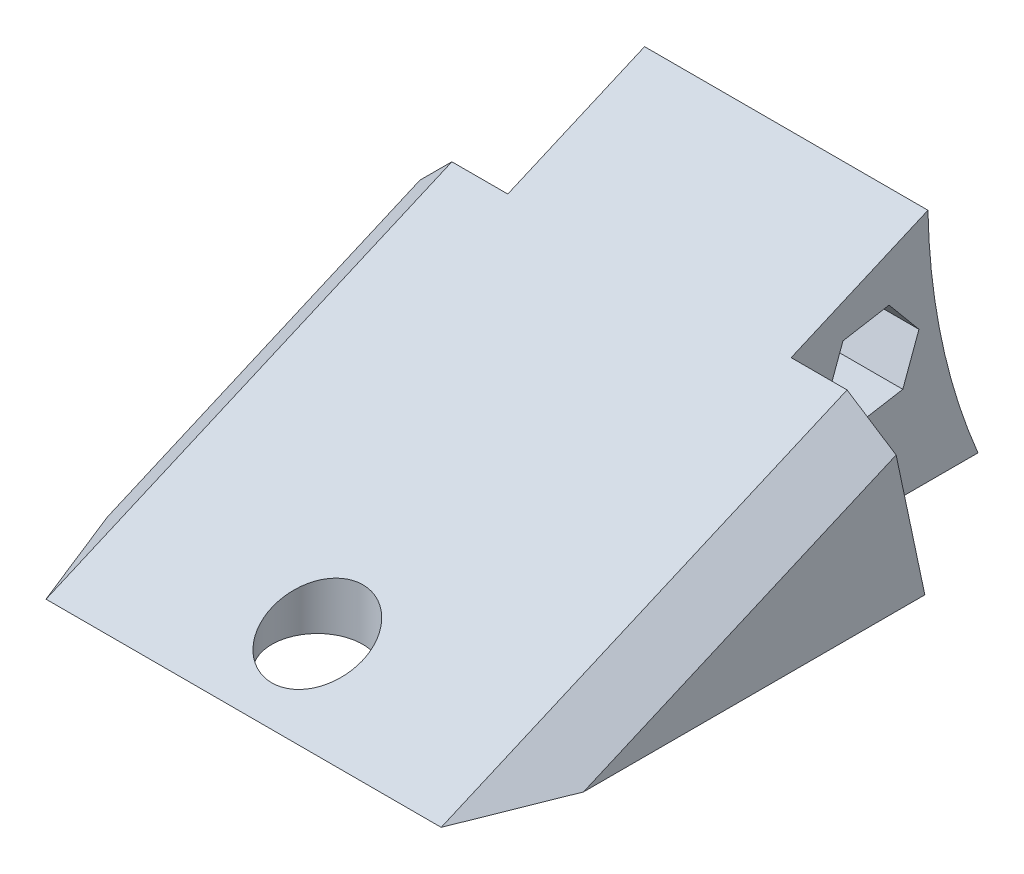
ISO-10303-21;
HEADER;
FILE_DESCRIPTION(('STEP AP214'),'2;1');
FILE_NAME('part.step','',(''),(''),'','','');
FILE_SCHEMA(('AUTOMOTIVE_DESIGN { 1 0 10303 214 1 1 1 1 }'));
ENDSEC;
DATA;
#1=APPLICATION_CONTEXT('core data for automotive mechanical design processes');
#2=APPLICATION_PROTOCOL_DEFINITION('international standard','automotive_design',2000,#1);
#3=PRODUCT_CONTEXT('',#1,'mechanical');
#4=PRODUCT('Part','Part','',(#3));
#5=PRODUCT_RELATED_PRODUCT_CATEGORY('part','',(#4));
#6=PRODUCT_DEFINITION_FORMATION('','',#4);
#7=PRODUCT_DEFINITION_CONTEXT('part definition',#1,'design');
#8=PRODUCT_DEFINITION('design','',#6,#7);
#9=PRODUCT_DEFINITION_SHAPE('','',#8);
#10=(LENGTH_UNIT() NAMED_UNIT(*) SI_UNIT(.MILLI.,.METRE.));
#11=(NAMED_UNIT(*) PLANE_ANGLE_UNIT() SI_UNIT($,.RADIAN.));
#12=(NAMED_UNIT(*) SI_UNIT($,.STERADIAN.) SOLID_ANGLE_UNIT());
#13=UNCERTAINTY_MEASURE_WITH_UNIT(LENGTH_MEASURE(1.E-05),#10,'distance_accuracy_value','');
#14=(GEOMETRIC_REPRESENTATION_CONTEXT(3) GLOBAL_UNCERTAINTY_ASSIGNED_CONTEXT((#13)) GLOBAL_UNIT_ASSIGNED_CONTEXT((#10,
#11,#12)) REPRESENTATION_CONTEXT('',''));
#15=CARTESIAN_POINT('',(0.,0.,0.));
#16=DIRECTION('',(0.,0.,1.));
#17=DIRECTION('',(1.,0.,0.));
#18=AXIS2_PLACEMENT_3D('',#15,#16,#17);
#19=CARTESIAN_POINT('',(43.38895928072,37.5,0.));
#20=DIRECTION('',(0.,1.,0.));
#21=DIRECTION('',(0.,0.,1.));
#22=AXIS2_PLACEMENT_3D('',#19,#20,#21);
#23=PLANE('',#22);
#24=CARTESIAN_POINT('',(0.,37.5,109.321224588876));
#25=DIRECTION('',(0.,1.,0.));
#26=DIRECTION('',(0.,0.,1.));
#27=AXIS2_PLACEMENT_3D('',#24,#25,#26);
#28=CIRCLE('',#27,4.5);
#29=CARTESIAN_POINT('',(0.,37.5,113.821224588876));
#30=VERTEX_POINT('',#29);
#31=EDGE_CURVE('E252',#30,#30,#28,.T.);
#32=ORIENTED_EDGE('',*,*,#31,.T.);
#33=EDGE_LOOP('',(#32));
#34=FACE_BOUND('',#33,.T.);
#35=DIRECTION('',(-1.,0.,0.));
#36=VECTOR('',#35,1.);
#37=CARTESIAN_POINT('',(71.1880662084405,37.5,116.608854977767));
#38=LINE('',#37,#36);
#39=CARTESIAN_POINT('',(19.525,37.5,116.608854977767));
#40=VERTEX_POINT('',#39);
#41=CARTESIAN_POINT('',(-19.525,37.5,116.608854977767));
#42=VERTEX_POINT('',#41);
#43=EDGE_CURVE('E264',#40,#42,#38,.T.);
#44=ORIENTED_EDGE('',*,*,#43,.T.);
#45=DIRECTION('',(-0.369479629785518,0.,-0.929238829996657));
#46=VECTOR('',#45,1.);
#47=CARTESIAN_POINT('',(-48.534045440784,37.5,43.6512971812466));
#48=LINE('',#47,#46);
#49=CARTESIAN_POINT('',(-23.525,37.5,106.548881381539));
#50=VERTEX_POINT('',#49);
#51=EDGE_CURVE('E241',#42,#50,#48,.T.);
#52=ORIENTED_EDGE('',*,*,#51,.T.);
#53=DIRECTION('',(0.,0.,-1.));
#54=VECTOR('',#53,1.);
#55=CARTESIAN_POINT('',(-23.525,37.5,0.));
#56=LINE('',#55,#54);
#57=CARTESIAN_POINT('',(-23.525,37.5,72.8184863524507));
#58=VERTEX_POINT('',#57);
#59=EDGE_CURVE('E254',#50,#58,#56,.T.);
#60=ORIENTED_EDGE('',*,*,#59,.T.);
#61=DIRECTION('',(-1.,0.,0.));
#62=VECTOR('',#61,1.);
#63=CARTESIAN_POINT('',(43.38895928072,37.5,72.8184863524507));
#64=LINE('',#63,#62);
#65=CARTESIAN_POINT('',(-14.,37.5,72.8184863524507));
#66=VERTEX_POINT('',#65);
#67=EDGE_CURVE('E171',#66,#58,#64,.T.);
#68=ORIENTED_EDGE('',*,*,#67,.F.);
#69=DIRECTION('',(0.,0.,-1.));
#70=VECTOR('',#69,1.);
#71=CARTESIAN_POINT('',(-14.,37.5,0.));
#72=LINE('',#71,#70);
#73=CARTESIAN_POINT('',(-14.,37.5,58.0409338312195));
#74=VERTEX_POINT('',#73);
#75=EDGE_CURVE('E161',#66,#74,#72,.T.);
#76=ORIENTED_EDGE('',*,*,#75,.T.);
#77=DIRECTION('',(-1.,0.,0.));
#78=VECTOR('',#77,1.);
#79=CARTESIAN_POINT('',(43.38895928072,37.5,58.0409338312195));
#80=LINE('',#79,#78);
#81=CARTESIAN_POINT('',(14.,37.5,58.0409338312195));
#82=VERTEX_POINT('',#81);
#83=EDGE_CURVE('E145',#82,#74,#80,.T.);
#84=ORIENTED_EDGE('',*,*,#83,.F.);
#85=DIRECTION('',(0.,0.,-1.));
#86=VECTOR('',#85,1.);
#87=CARTESIAN_POINT('',(14.,37.5,0.));
#88=LINE('',#87,#86);
#89=CARTESIAN_POINT('',(14.,37.5,72.8184863524507));
#90=VERTEX_POINT('',#89);
#91=EDGE_CURVE('E205',#90,#82,#88,.T.);
#92=ORIENTED_EDGE('',*,*,#91,.F.);
#93=DIRECTION('',(-1.,0.,0.));
#94=VECTOR('',#93,1.);
#95=CARTESIAN_POINT('',(43.38895928072,37.5,72.8184863524507));
#96=LINE('',#95,#94);
#97=CARTESIAN_POINT('',(23.525,37.5,72.8184863524507));
#98=VERTEX_POINT('',#97);
#99=EDGE_CURVE('E255',#98,#90,#96,.T.);
#100=ORIENTED_EDGE('',*,*,#99,.F.);
#101=DIRECTION('',(0.,0.,-1.));
#102=VECTOR('',#101,1.);
#103=CARTESIAN_POINT('',(23.525,37.5,0.));
#104=LINE('',#103,#102);
#105=CARTESIAN_POINT('',(23.525,37.5,106.548881381539));
#106=VERTEX_POINT('',#105);
#107=EDGE_CURVE('E273',#106,#98,#104,.T.);
#108=ORIENTED_EDGE('',*,*,#107,.F.);
#109=DIRECTION('',(-0.369479629785519,0.,0.929238829996657));
#110=VECTOR('',#109,1.);
#111=CARTESIAN_POINT('',(57.3922757474116,37.5,21.3729064327504));
#112=LINE('',#111,#110);
#113=EDGE_CURVE('E239',#106,#40,#112,.T.);
#114=ORIENTED_EDGE('',*,*,#113,.T.);
#115=EDGE_LOOP('',(#44,#52,#60,#68,#76,#84,#92,#100,#108,#114));
#116=FACE_BOUND('',#115,.T.);
#117=ADVANCED_FACE('F44',(#34,#116),#23,.F.);
#118=CARTESIAN_POINT('',(43.38895928072,62.,0.));
#119=DIRECTION('',(-1.,0.,0.));
#120=DIRECTION('',(0.,0.,1.));
#121=AXIS2_PLACEMENT_3D('',#118,#119,#120);
#122=CYLINDRICAL_SURFACE('',#121,63.);
#123=CARTESIAN_POINT('',(14.,62.,0.));
#124=DIRECTION('',(1.,0.,0.));
#125=DIRECTION('',(0.,0.,-1.));
#126=AXIS2_PLACEMENT_3D('',#123,#124,#125);
#127=CIRCLE('',#126,63.);
#128=CARTESIAN_POINT('',(14.,60.7365441284118,62.9873295136454));
#129=VERTEX_POINT('',#128);
#130=EDGE_CURVE('E151',#82,#129,#127,.F.);
#131=ORIENTED_EDGE('',*,*,#130,.F.);
#132=ORIENTED_EDGE('',*,*,#83,.T.);
#133=CARTESIAN_POINT('',(-14.,62.,0.));
#134=DIRECTION('',(-1.,0.,0.));
#135=DIRECTION('',(0.,0.,1.));
#136=AXIS2_PLACEMENT_3D('',#133,#134,#135);
#137=CIRCLE('',#136,63.);
#138=CARTESIAN_POINT('',(-14.,60.7365441284118,62.9873295136454));
#139=VERTEX_POINT('',#138);
#140=EDGE_CURVE('E149',#74,#139,#137,.T.);
#141=ORIENTED_EDGE('',*,*,#140,.T.);
#142=DIRECTION('',(-1.,0.,0.));
#143=VECTOR('',#142,1.);
#144=CARTESIAN_POINT('',(43.38895928072,60.7365441284118,62.9873295136454));
#145=LINE('',#144,#143);
#146=EDGE_CURVE('E155',#129,#139,#145,.T.);
#147=ORIENTED_EDGE('',*,*,#146,.F.);
#148=EDGE_LOOP('',(#131,#132,#141,#147));
#149=FACE_BOUND('',#148,.T.);
#150=ADVANCED_FACE('F147',(#149),#122,.F.);
#151=CARTESIAN_POINT('',(43.38895928072,74.1140661666152,32.1168552015343));
#152=DIRECTION('',(0.,-0.917552193237277,-0.397615357708254));
#153=DIRECTION('',(0.,0.397615357708254,-0.917552193237277));
#154=AXIS2_PLACEMENT_3D('',#151,#152,#153);
#155=PLANE('',#154);
#156=CARTESIAN_POINT('',(0.,40.6580478857568,109.321224588876));
#157=DIRECTION('',(0.,-0.917552193237277,-0.397615357708254));
#158=DIRECTION('',(0.,-0.397615357708254,0.917552193237277));
#159=AXIS2_PLACEMENT_3D('',#156,#157,#158);
#160=ELLIPSE('',#159,4.90435316177846,4.5);
#161=CARTESIAN_POINT('',(0.,38.7080017490087,113.821224588876));
#162=VERTEX_POINT('',#161);
#163=EDGE_CURVE('E248',#162,#162,#160,.F.);
#164=ORIENTED_EDGE('',*,*,#163,.F.);
#165=EDGE_LOOP('',(#164));
#166=FACE_BOUND('',#165,.T.);
#167=DIRECTION('',(-1.,0.,0.));
#168=VECTOR('',#167,1.);
#169=CARTESIAN_POINT('',(71.1880662084405,54.8797179048589,76.5027625638284));
#170=LINE('',#169,#168);
#171=CARTESIAN_POINT('',(-14.,54.879717904859,76.5027625638284));
#172=VERTEX_POINT('',#171);
#173=CARTESIAN_POINT('',(-19.525,54.879717904859,76.5027625638285));
#174=VERTEX_POINT('',#173);
#175=EDGE_CURVE('E258',#172,#174,#170,.T.);
#176=ORIENTED_EDGE('',*,*,#175,.T.);
#177=DIRECTION('',(0.,-0.397615357708254,0.917552193237277));
#178=VECTOR('',#177,1.);
#179=CARTESIAN_POINT('',(-19.525,37.5,116.608854977767));
#180=LINE('',#179,#178);
#181=EDGE_CURVE('E236',#174,#42,#180,.T.);
#182=ORIENTED_EDGE('',*,*,#181,.T.);
#183=ORIENTED_EDGE('',*,*,#43,.F.);
#184=DIRECTION('',(0.,0.397615357708254,-0.917552193237277));
#185=VECTOR('',#184,1.);
#186=CARTESIAN_POINT('',(19.525,55.0825700006713,76.034653418125));
#187=LINE('',#186,#185);
#188=CARTESIAN_POINT('',(19.525,54.879717904859,76.5027625638285));
#189=VERTEX_POINT('',#188);
#190=EDGE_CURVE('E203',#40,#189,#187,.T.);
#191=ORIENTED_EDGE('',*,*,#190,.T.);
#192=DIRECTION('',(-1.,0.,0.));
#193=VECTOR('',#192,1.);
#194=CARTESIAN_POINT('',(71.1880662084405,54.8797179048589,76.5027625638284));
#195=LINE('',#194,#193);
#196=CARTESIAN_POINT('',(14.,54.879717904859,76.5027625638284));
#197=VERTEX_POINT('',#196);
#198=EDGE_CURVE('E261',#189,#197,#195,.T.);
#199=ORIENTED_EDGE('',*,*,#198,.T.);
#200=DIRECTION('',(0.,-0.397615357708254,0.917552193237277));
#201=VECTOR('',#200,1.);
#202=CARTESIAN_POINT('',(14.,74.1140661666152,32.1168552015343));
#203=LINE('',#202,#201);
#204=EDGE_CURVE('E200',#129,#197,#203,.T.);
#205=ORIENTED_EDGE('',*,*,#204,.F.);
#206=ORIENTED_EDGE('',*,*,#146,.T.);
#207=DIRECTION('',(0.,-0.397615357708254,0.917552193237277));
#208=VECTOR('',#207,1.);
#209=CARTESIAN_POINT('',(-14.,74.1140661666152,32.1168552015343));
#210=LINE('',#209,#208);
#211=EDGE_CURVE('E164',#139,#172,#210,.T.);
#212=ORIENTED_EDGE('',*,*,#211,.T.);
#213=EDGE_LOOP('',(#176,#182,#183,#191,#199,#205,#206,#212));
#214=FACE_BOUND('',#213,.T.);
#215=ADVANCED_FACE('F278',(#166,#214),#155,.F.);
#216=CARTESIAN_POINT('',(43.38895928072,64.1529755927277,11.0578583407304));
#217=DIRECTION('',(0.,-0.985467829579259,-0.169862170197913));
#218=DIRECTION('',(0.,0.169862170197913,-0.985467829579259));
#219=AXIS2_PLACEMENT_3D('',#216,#217,#218);
#220=PLANE('',#219);
#221=DIRECTION('',(-1.,0.,0.));
#222=VECTOR('',#221,1.);
#223=CARTESIAN_POINT('',(43.38895928072,54.5396347679766,66.8303596960064));
#224=LINE('',#223,#222);
#225=CARTESIAN_POINT('',(14.,54.5396347679766,66.8303596960064));
#226=VERTEX_POINT('',#225);
#227=CARTESIAN_POINT('',(-14.,54.5396347679766,66.8303596960064));
#228=VERTEX_POINT('',#227);
#229=EDGE_CURVE('E215',#226,#228,#224,.T.);
#230=ORIENTED_EDGE('',*,*,#229,.F.);
#231=DIRECTION('',(0.,-0.169862170197913,0.985467829579259));
#232=VECTOR('',#231,1.);
#233=CARTESIAN_POINT('',(14.,64.1529755927277,11.0578583407304));
#234=LINE('',#233,#232);
#235=CARTESIAN_POINT('',(14.,53.7550750104654,71.3820406294888));
#236=VERTEX_POINT('',#235);
#237=EDGE_CURVE('E208',#226,#236,#234,.T.);
#238=ORIENTED_EDGE('',*,*,#237,.T.);
#239=DIRECTION('',(-1.,0.,0.));
#240=VECTOR('',#239,1.);
#241=CARTESIAN_POINT('',(43.38895928072,53.7550750104654,71.3820406294888));
#242=LINE('',#241,#240);
#243=CARTESIAN_POINT('',(-14.,53.7550750104654,71.3820406294888));
#244=VERTEX_POINT('',#243);
#245=EDGE_CURVE('E211',#236,#244,#242,.T.);
#246=ORIENTED_EDGE('',*,*,#245,.T.);
#247=DIRECTION('',(0.,-0.169862170197913,0.985467829579259));
#248=VECTOR('',#247,1.);
#249=CARTESIAN_POINT('',(-14.,64.1529755927277,11.0578583407304));
#250=LINE('',#249,#248);
#251=EDGE_CURVE('E165',#228,#244,#250,.T.);
#252=ORIENTED_EDGE('',*,*,#251,.F.);
#253=EDGE_LOOP('',(#230,#238,#246,#252));
#254=FACE_BOUND('',#253,.T.);
#255=ADVANCED_FACE('F341',(#254),#220,.T.);
#256=CARTESIAN_POINT('',(43.38895928072,-10.533770106256,12.6520886210708));
#257=DIRECTION('',(0.,-0.639838869322976,0.768509089928997));
#258=DIRECTION('',(0.,-0.768509089928997,-0.639838869322976));
#259=AXIS2_PLACEMENT_3D('',#256,#257,#258);
#260=PLANE('',#259);
#261=DIRECTION('',(-1.,0.,0.));
#262=VECTOR('',#261,1.);
#263=CARTESIAN_POINT('',(43.38895928072,50.9900433284151,63.8750705484735));
#264=LINE('',#263,#262);
#265=CARTESIAN_POINT('',(14.,50.9900433284151,63.8750705484735));
#266=VERTEX_POINT('',#265);
#267=CARTESIAN_POINT('',(-14.,50.9900433284151,63.8750705484735));
#268=VERTEX_POINT('',#267);
#269=EDGE_CURVE('E219',#266,#268,#264,.T.);
#270=ORIENTED_EDGE('',*,*,#269,.F.);
#271=DIRECTION('',(0.,0.768509089928997,0.639838869322976));
#272=VECTOR('',#271,1.);
#273=CARTESIAN_POINT('',(14.,-10.533770106256,12.6520886210708));
#274=LINE('',#273,#272);
#275=EDGE_CURVE('E212',#266,#226,#274,.T.);
#276=ORIENTED_EDGE('',*,*,#275,.T.);
#277=ORIENTED_EDGE('',*,*,#229,.T.);
#278=DIRECTION('',(0.,0.768509089928997,0.639838869322976));
#279=VECTOR('',#278,1.);
#280=CARTESIAN_POINT('',(-14.,-10.533770106256,12.6520886210708));
#281=LINE('',#280,#279);
#282=EDGE_CURVE('E172',#268,#228,#281,.T.);
#283=ORIENTED_EDGE('',*,*,#282,.F.);
#284=EDGE_LOOP('',(#270,#276,#277,#283));
#285=FACE_BOUND('',#284,.T.);
#286=ADVANCED_FACE('F345',(#285),#260,.T.);
#287=CARTESIAN_POINT('',(43.38895928072,26.807730824468,72.7821075417009));
#288=DIRECTION('',(0.,0.345628960256283,0.938371260126908));
#289=DIRECTION('',(0.,-0.938371260126908,0.345628960256283));
#290=AXIS2_PLACEMENT_3D('',#287,#288,#289);
#291=PLANE('',#290);
#292=DIRECTION('',(-1.,0.,0.));
#293=VECTOR('',#292,1.);
#294=CARTESIAN_POINT('',(43.38895928072,46.6558921313425,65.4714623344231));
#295=LINE('',#294,#293);
#296=CARTESIAN_POINT('',(14.,46.6558921313425,65.4714623344231));
#297=VERTEX_POINT('',#296);
#298=CARTESIAN_POINT('',(-14.,46.6558921313425,65.4714623344231));
#299=VERTEX_POINT('',#298);
#300=EDGE_CURVE('E223',#297,#299,#295,.T.);
#301=ORIENTED_EDGE('',*,*,#300,.F.);
#302=DIRECTION('',(0.,0.938371260126908,-0.345628960256283));
#303=VECTOR('',#302,1.);
#304=CARTESIAN_POINT('',(14.,26.807730824468,72.7821075417009));
#305=LINE('',#304,#303);
#306=EDGE_CURVE('E216',#297,#266,#305,.T.);
#307=ORIENTED_EDGE('',*,*,#306,.T.);
#308=ORIENTED_EDGE('',*,*,#269,.T.);
#309=DIRECTION('',(0.,0.938371260126908,-0.345628960256283));
#310=VECTOR('',#309,1.);
#311=CARTESIAN_POINT('',(-14.,26.807730824468,72.7821075417009));
#312=LINE('',#311,#310);
#313=EDGE_CURVE('E176',#299,#268,#312,.T.);
#314=ORIENTED_EDGE('',*,*,#313,.F.);
#315=EDGE_LOOP('',(#301,#307,#308,#314));
#316=FACE_BOUND('',#315,.T.);
#317=ADVANCED_FACE('F351',(#316),#291,.T.);
#318=CARTESIAN_POINT('',(43.38895928072,56.2692329560937,9.69896097914706));
#319=DIRECTION('',(0.,0.985467829579259,0.169862170197913));
#320=DIRECTION('',(0.,-0.169862170197913,0.985467829579259));
#321=AXIS2_PLACEMENT_3D('',#318,#319,#320);
#322=PLANE('',#321);
#323=DIRECTION('',(-1.,0.,0.));
#324=VECTOR('',#323,1.);
#325=CARTESIAN_POINT('',(43.38895928072,45.8713323738313,70.0231432679055));
#326=LINE('',#325,#324);
#327=CARTESIAN_POINT('',(14.,45.8713323738313,70.0231432679055));
#328=VERTEX_POINT('',#327);
#329=CARTESIAN_POINT('',(-14.,45.8713323738313,70.0231432679055));
#330=VERTEX_POINT('',#329);
#331=EDGE_CURVE('E199',#328,#330,#326,.T.);
#332=ORIENTED_EDGE('',*,*,#331,.F.);
#333=DIRECTION('',(0.,0.169862170197913,-0.985467829579259));
#334=VECTOR('',#333,1.);
#335=CARTESIAN_POINT('',(14.,56.2692329560937,9.69896097914706));
#336=LINE('',#335,#334);
#337=EDGE_CURVE('E220',#328,#297,#336,.T.);
#338=ORIENTED_EDGE('',*,*,#337,.T.);
#339=ORIENTED_EDGE('',*,*,#300,.T.);
#340=DIRECTION('',(0.,0.169862170197913,-0.985467829579259));
#341=VECTOR('',#340,1.);
#342=CARTESIAN_POINT('',(-14.,56.2692329560937,9.69896097914706));
#343=LINE('',#342,#341);
#344=EDGE_CURVE('E184',#330,#299,#343,.T.);
#345=ORIENTED_EDGE('',*,*,#344,.F.);
#346=EDGE_LOOP('',(#332,#338,#339,#345));
#347=FACE_BOUND('',#346,.T.);
#348=ADVANCED_FACE('F355',(#347),#322,.T.);
#349=CARTESIAN_POINT('',(43.38895928072,-15.6524810608398,18.8001613405028));
#350=DIRECTION('',(0.,0.639838869322976,-0.768509089928997));
#351=DIRECTION('',(0.,0.768509089928997,0.639838869322976));
#352=AXIS2_PLACEMENT_3D('',#349,#350,#351);
#353=PLANE('',#352);
#354=DIRECTION('',(-1.,0.,0.));
#355=VECTOR('',#354,1.);
#356=CARTESIAN_POINT('',(43.38895928072,49.4209238133928,72.9784324154383));
#357=LINE('',#356,#355);
#358=CARTESIAN_POINT('',(14.,49.4209238133928,72.9784324154383));
#359=VERTEX_POINT('',#358);
#360=CARTESIAN_POINT('',(-14.,49.4209238133928,72.9784324154383));
#361=VERTEX_POINT('',#360);
#362=EDGE_CURVE('E198',#359,#361,#357,.T.);
#363=ORIENTED_EDGE('',*,*,#362,.F.);
#364=DIRECTION('',(0.,-0.768509089928997,-0.639838869322976));
#365=VECTOR('',#364,1.);
#366=CARTESIAN_POINT('',(14.,-15.6524810608398,18.8001613405028));
#367=LINE('',#366,#365);
#368=EDGE_CURVE('E224',#359,#328,#367,.T.);
#369=ORIENTED_EDGE('',*,*,#368,.T.);
#370=ORIENTED_EDGE('',*,*,#331,.T.);
#371=DIRECTION('',(0.,-0.768509089928997,-0.639838869322976));
#372=VECTOR('',#371,1.);
#373=CARTESIAN_POINT('',(-14.,-15.6524810608398,18.8001613405028));
#374=LINE('',#373,#372);
#375=EDGE_CURVE('E187',#361,#330,#374,.T.);
#376=ORIENTED_EDGE('',*,*,#375,.F.);
#377=EDGE_LOOP('',(#363,#369,#370,#376));
#378=FACE_BOUND('',#377,.T.);
#379=ADVANCED_FACE('F359',(#378),#353,.T.);
#380=CARTESIAN_POINT('',(43.38895928072,29.5727625065183,80.2890776227161));
#381=DIRECTION('',(0.,-0.345628960256283,-0.938371260126908));
#382=DIRECTION('',(0.,0.938371260126908,-0.345628960256283));
#383=AXIS2_PLACEMENT_3D('',#380,#381,#382);
#384=PLANE('',#383);
#385=ORIENTED_EDGE('',*,*,#245,.F.);
#386=DIRECTION('',(0.,-0.938371260126908,0.345628960256283));
#387=VECTOR('',#386,1.);
#388=CARTESIAN_POINT('',(14.,29.5727625065183,80.2890776227161));
#389=LINE('',#388,#387);
#390=EDGE_CURVE('E195',#236,#359,#389,.T.);
#391=ORIENTED_EDGE('',*,*,#390,.T.);
#392=ORIENTED_EDGE('',*,*,#362,.T.);
#393=DIRECTION('',(0.,-0.938371260126908,0.345628960256283));
#394=VECTOR('',#393,1.);
#395=CARTESIAN_POINT('',(-14.,29.5727625065183,80.2890776227161));
#396=LINE('',#395,#394);
#397=EDGE_CURVE('E190',#244,#361,#396,.T.);
#398=ORIENTED_EDGE('',*,*,#397,.F.);
#399=EDGE_LOOP('',(#385,#391,#392,#398));
#400=FACE_BOUND('',#399,.T.);
#401=ADVANCED_FACE('F321',(#400),#384,.T.);
#402=CARTESIAN_POINT('',(14.,62.,0.));
#403=DIRECTION('',(1.,0.,0.));
#404=DIRECTION('',(0.,0.,-1.));
#405=AXIS2_PLACEMENT_3D('',#402,#403,#404);
#406=PLANE('',#405);
#407=ORIENTED_EDGE('',*,*,#237,.F.);
#408=ORIENTED_EDGE('',*,*,#275,.F.);
#409=ORIENTED_EDGE('',*,*,#306,.F.);
#410=ORIENTED_EDGE('',*,*,#337,.F.);
#411=ORIENTED_EDGE('',*,*,#368,.F.);
#412=ORIENTED_EDGE('',*,*,#390,.F.);
#413=EDGE_LOOP('',(#407,#408,#409,#410,#411,#412));
#414=FACE_BOUND('',#413,.T.);
#415=DIRECTION('',(0.,-0.978260745904019,-0.20737867060841));
#416=VECTOR('',#415,1.);
#417=CARTESIAN_POINT('',(14.,-13.1599946615431,62.0792203746142));
#418=LINE('',#417,#416);
#419=EDGE_CURVE('E207',#197,#90,#418,.T.);
#420=ORIENTED_EDGE('',*,*,#419,.T.);
#421=ORIENTED_EDGE('',*,*,#91,.T.);
#422=ORIENTED_EDGE('',*,*,#130,.T.);
#423=ORIENTED_EDGE('',*,*,#204,.T.);
#424=EDGE_LOOP('',(#420,#421,#422,#423));
#425=FACE_BOUND('',#424,.T.);
#426=ADVANCED_FACE('F289',(#414,#425),#406,.T.);
#427=CARTESIAN_POINT('',(-14.,62.,0.));
#428=DIRECTION('',(-1.,0.,0.));
#429=DIRECTION('',(0.,0.,-1.));
#430=AXIS2_PLACEMENT_3D('',#427,#428,#429);
#431=PLANE('',#430);
#432=ORIENTED_EDGE('',*,*,#75,.F.);
#433=DIRECTION('',(0.,-0.978260745904019,-0.20737867060841));
#434=VECTOR('',#433,1.);
#435=CARTESIAN_POINT('',(-14.,46.1736387310116,74.6571859802402));
#436=LINE('',#435,#434);
#437=EDGE_CURVE('E173',#172,#66,#436,.T.);
#438=ORIENTED_EDGE('',*,*,#437,.F.);
#439=ORIENTED_EDGE('',*,*,#211,.F.);
#440=ORIENTED_EDGE('',*,*,#140,.F.);
#441=EDGE_LOOP('',(#432,#438,#439,#440));
#442=FACE_BOUND('',#441,.T.);
#443=ORIENTED_EDGE('',*,*,#282,.T.);
#444=ORIENTED_EDGE('',*,*,#251,.T.);
#445=ORIENTED_EDGE('',*,*,#397,.T.);
#446=ORIENTED_EDGE('',*,*,#375,.T.);
#447=ORIENTED_EDGE('',*,*,#344,.T.);
#448=ORIENTED_EDGE('',*,*,#313,.T.);
#449=EDGE_LOOP('',(#443,#444,#445,#446,#447,#448));
#450=FACE_BOUND('',#449,.T.);
#451=ADVANCED_FACE('F159',(#442,#450),#431,.T.);
#452=CARTESIAN_POINT('',(71.1880662084405,-13.1599946615431,62.0792203746142));
#453=DIRECTION('',(0.,0.20737867060841,-0.978260745904019));
#454=DIRECTION('',(0.,0.978260745904019,0.20737867060841));
#455=AXIS2_PLACEMENT_3D('',#452,#453,#454);
#456=PLANE('',#455);
#457=ORIENTED_EDGE('',*,*,#198,.F.);
#458=DIRECTION('',(0.699951255576236,-0.698664647352159,-0.148107901063833));
#459=VECTOR('',#458,1.);
#460=CARTESIAN_POINT('',(79.6051833152776,-5.09002963743919,63.7899489565001));
#461=LINE('',#460,#459);
#462=CARTESIAN_POINT('',(23.525,50.8870704638483,75.6563727623449));
#463=VERTEX_POINT('',#462);
#464=EDGE_CURVE('E12',#189,#463,#461,.T.);
#465=ORIENTED_EDGE('',*,*,#464,.T.);
#466=DIRECTION('',(0.,-0.978260745904019,-0.20737867060841));
#467=VECTOR('',#466,1.);
#468=CARTESIAN_POINT('',(23.525,-13.1599946615431,62.0792203746142));
#469=LINE('',#468,#467);
#470=EDGE_CURVE('E256',#463,#98,#469,.T.);
#471=ORIENTED_EDGE('',*,*,#470,.T.);
#472=ORIENTED_EDGE('',*,*,#99,.T.);
#473=ORIENTED_EDGE('',*,*,#419,.F.);
#474=EDGE_LOOP('',(#457,#465,#471,#472,#473));
#475=FACE_BOUND('',#474,.T.);
#476=ADVANCED_FACE('F287',(#475),#456,.T.);
#477=DIRECTION('',(0.,-0.978260745904019,-0.20737867060841));
#478=VECTOR('',#477,1.);
#479=CARTESIAN_POINT('',(-23.525,46.1736387310116,74.6571859802402));
#480=LINE('',#479,#478);
#481=CARTESIAN_POINT('',(-23.525,50.8870704638483,75.6563727623449));
#482=VERTEX_POINT('',#481);
#483=EDGE_CURVE('E251',#482,#58,#480,.T.);
#484=ORIENTED_EDGE('',*,*,#483,.F.);
#485=DIRECTION('',(0.699951255576234,0.698664647352161,0.148107901063834));
#486=VECTOR('',#485,1.);
#487=CARTESIAN_POINT('',(-9.85059415226311,64.5363408426752,78.5498421750628));
#488=LINE('',#487,#486);
#489=EDGE_CURVE('E245',#482,#174,#488,.T.);
#490=ORIENTED_EDGE('',*,*,#489,.T.);
#491=ORIENTED_EDGE('',*,*,#175,.F.);
#492=ORIENTED_EDGE('',*,*,#437,.T.);
#493=ORIENTED_EDGE('',*,*,#67,.T.);
#494=EDGE_LOOP('',(#484,#490,#491,#492,#493));
#495=FACE_BOUND('',#494,.T.);
#496=ADVANCED_FACE('F46',(#495),#456,.T.);
#497=CARTESIAN_POINT('',(23.525,62.,0.));
#498=DIRECTION('',(1.,0.,0.));
#499=DIRECTION('',(0.,0.,-1.));
#500=AXIS2_PLACEMENT_3D('',#497,#498,#499);
#501=PLANE('',#500);
#502=ORIENTED_EDGE('',*,*,#470,.F.);
#503=DIRECTION('',(0.,-0.397615357708254,0.917552193237277));
#504=VECTOR('',#503,1.);
#505=CARTESIAN_POINT('',(23.525,33.8297912270508,115.018393546934));
#506=LINE('',#505,#504);
#507=EDGE_CURVE('E53',#463,#106,#506,.T.);
#508=ORIENTED_EDGE('',*,*,#507,.T.);
#509=ORIENTED_EDGE('',*,*,#107,.T.);
#510=EDGE_LOOP('',(#502,#508,#509));
#511=FACE_BOUND('',#510,.T.);
#512=ADVANCED_FACE('F284',(#511),#501,.T.);
#513=CARTESIAN_POINT('',(-23.525,62.,0.));
#514=DIRECTION('',(-1.,0.,0.));
#515=DIRECTION('',(0.,0.,-1.));
#516=AXIS2_PLACEMENT_3D('',#513,#514,#515);
#517=PLANE('',#516);
#518=ORIENTED_EDGE('',*,*,#59,.F.);
#519=DIRECTION('',(0.,0.397615357708254,-0.917552193237277));
#520=VECTOR('',#519,1.);
#521=CARTESIAN_POINT('',(-23.525,51.4123612277222,74.444191987292));
#522=LINE('',#521,#520);
#523=EDGE_CURVE('E243',#50,#482,#522,.T.);
#524=ORIENTED_EDGE('',*,*,#523,.T.);
#525=ORIENTED_EDGE('',*,*,#483,.T.);
#526=EDGE_LOOP('',(#518,#524,#525));
#527=FACE_BOUND('',#526,.T.);
#528=ADVANCED_FACE('F298',(#527),#517,.T.);
#529=CARTESIAN_POINT('',(-19.525,74.1140661666152,32.1168552015343));
#530=DIRECTION('',(-0.70710678118655,0.648807377930666,0.28115651573942));
#531=DIRECTION('',(0.,0.397615357708254,-0.917552193237277));
#532=AXIS2_PLACEMENT_3D('',#529,#530,#531);
#533=PLANE('',#532);
#534=ORIENTED_EDGE('',*,*,#489,.F.);
#535=ORIENTED_EDGE('',*,*,#523,.F.);
#536=ORIENTED_EDGE('',*,*,#51,.F.);
#537=ORIENTED_EDGE('',*,*,#181,.F.);
#538=EDGE_LOOP('',(#534,#535,#536,#537));
#539=FACE_BOUND('',#538,.T.);
#540=ADVANCED_FACE('F296',(#539),#533,.T.);
#541=CARTESIAN_POINT('',(23.525,80.2459317001647,7.90675747183929));
#542=DIRECTION('',(0.707106781186548,0.648807377930667,0.281156515739421));
#543=DIRECTION('',(0.,0.397615357708254,-0.917552193237277));
#544=AXIS2_PLACEMENT_3D('',#541,#542,#543);
#545=PLANE('',#544);
#546=ORIENTED_EDGE('',*,*,#464,.F.);
#547=ORIENTED_EDGE('',*,*,#190,.F.);
#548=ORIENTED_EDGE('',*,*,#113,.F.);
#549=ORIENTED_EDGE('',*,*,#507,.F.);
#550=EDGE_LOOP('',(#546,#547,#548,#549));
#551=FACE_BOUND('',#550,.T.);
#552=ADVANCED_FACE('F281',(#551),#545,.T.);
#553=CARTESIAN_POINT('',(0.,112.121133082097,109.321224588876));
#554=DIRECTION('',(0.,-1.,0.));
#555=DIRECTION('',(0.,0.,-1.));
#556=AXIS2_PLACEMENT_3D('',#553,#554,#555);
#557=CYLINDRICAL_SURFACE('',#556,4.5);
#558=ORIENTED_EDGE('',*,*,#31,.F.);
#559=EDGE_LOOP('',(#558));
#560=FACE_BOUND('',#559,.T.);
#561=ORIENTED_EDGE('',*,*,#163,.T.);
#562=EDGE_LOOP('',(#561));
#563=FACE_BOUND('',#562,.T.);
#564=ADVANCED_FACE('F330',(#560,#563),#557,.F.);
#565=CLOSED_SHELL('',(#117,#150,#215,#255,#286,#317,#348,#379,#401,#426,#451,#476,#496,#512,
#528,#540,#552,#564));
#566=MANIFOLD_SOLID_BREP('B2',#565);
#567=ADVANCED_BREP_SHAPE_REPRESENTATION('',(#18,#566),#14);
#568=SHAPE_DEFINITION_REPRESENTATION(#9,#567);
ENDSEC;
END-ISO-10303-21;
